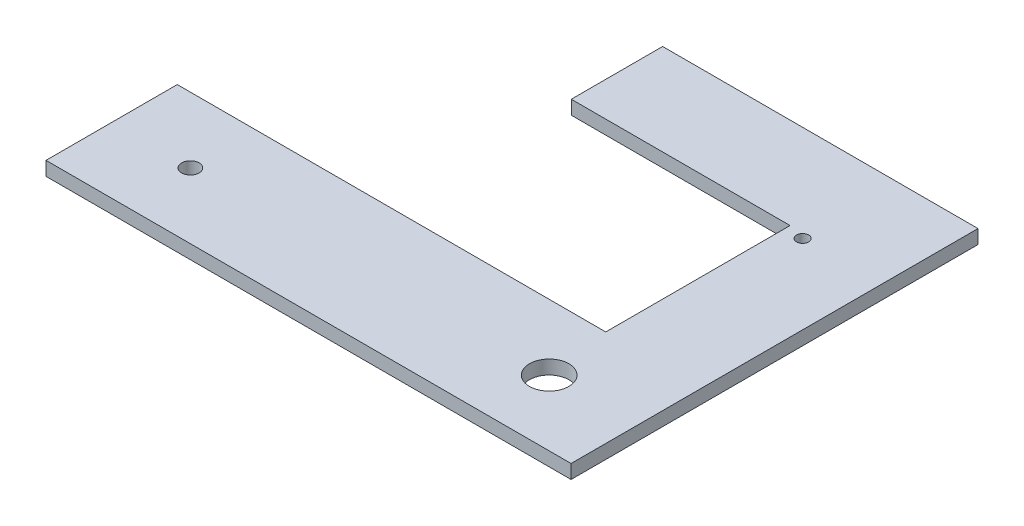
ISO-10303-21;
HEADER;
FILE_DESCRIPTION(('STEP AP214'),'2;1');
FILE_NAME('part.step','',(''),(''),'','','');
FILE_SCHEMA(('AUTOMOTIVE_DESIGN { 1 0 10303 214 1 1 1 1 }'));
ENDSEC;
DATA;
#1=APPLICATION_CONTEXT('core data for automotive mechanical design processes');
#2=APPLICATION_PROTOCOL_DEFINITION('international standard','automotive_design',2000,#1);
#3=PRODUCT_CONTEXT('',#1,'mechanical');
#4=PRODUCT('Part','Part','',(#3));
#5=PRODUCT_RELATED_PRODUCT_CATEGORY('part','',(#4));
#6=PRODUCT_DEFINITION_FORMATION('','',#4);
#7=PRODUCT_DEFINITION_CONTEXT('part definition',#1,'design');
#8=PRODUCT_DEFINITION('design','',#6,#7);
#9=PRODUCT_DEFINITION_SHAPE('','',#8);
#10=(LENGTH_UNIT() NAMED_UNIT(*) SI_UNIT(.MILLI.,.METRE.));
#11=(NAMED_UNIT(*) PLANE_ANGLE_UNIT() SI_UNIT($,.RADIAN.));
#12=(NAMED_UNIT(*) SI_UNIT($,.STERADIAN.) SOLID_ANGLE_UNIT());
#13=UNCERTAINTY_MEASURE_WITH_UNIT(LENGTH_MEASURE(1.E-05),#10,'distance_accuracy_value','');
#14=(GEOMETRIC_REPRESENTATION_CONTEXT(3) GLOBAL_UNCERTAINTY_ASSIGNED_CONTEXT((#13)) GLOBAL_UNIT_ASSIGNED_CONTEXT((#10,
#11,#12)) REPRESENTATION_CONTEXT('',''));
#15=CARTESIAN_POINT('',(0.,0.,0.));
#16=DIRECTION('',(0.,0.,1.));
#17=DIRECTION('',(1.,0.,0.));
#18=AXIS2_PLACEMENT_3D('',#15,#16,#17);
#19=CARTESIAN_POINT('',(97.9273861174557,0.,-93.));
#20=DIRECTION('',(1.,0.,0.));
#21=DIRECTION('',(0.,0.,-1.));
#22=AXIS2_PLACEMENT_3D('',#19,#20,#21);
#23=PLANE('',#22);
#24=DIRECTION('',(0.,1.,0.));
#25=VECTOR('',#24,1.);
#26=CARTESIAN_POINT('',(97.9273861174557,0.,-72.1241918278395));
#27=LINE('',#26,#25);
#28=CARTESIAN_POINT('',(97.9273861174557,0.,-72.1241918278395));
#29=VERTEX_POINT('',#28);
#30=CARTESIAN_POINT('',(97.9273861174557,3.175,-72.1241918278395));
#31=VERTEX_POINT('',#30);
#32=EDGE_CURVE('E138',#29,#31,#27,.T.);
#33=ORIENTED_EDGE('',*,*,#32,.F.);
#34=DIRECTION('',(0.,0.,1.));
#35=VECTOR('',#34,1.);
#36=CARTESIAN_POINT('',(97.9273861174557,0.,-93.));
#37=LINE('',#36,#35);
#38=CARTESIAN_POINT('',(97.9273861174557,0.,-30.));
#39=VERTEX_POINT('',#38);
#40=EDGE_CURVE('E58',#29,#39,#37,.T.);
#41=ORIENTED_EDGE('',*,*,#40,.T.);
#42=DIRECTION('',(0.,1.,0.));
#43=VECTOR('',#42,1.);
#44=CARTESIAN_POINT('',(97.9273861174557,0.,-30.));
#45=LINE('',#44,#43);
#46=CARTESIAN_POINT('',(97.9273861174557,3.175,-30.));
#47=VERTEX_POINT('',#46);
#48=EDGE_CURVE('E156',#39,#47,#45,.T.);
#49=ORIENTED_EDGE('',*,*,#48,.T.);
#50=DIRECTION('',(0.,0.,1.));
#51=VECTOR('',#50,1.);
#52=CARTESIAN_POINT('',(97.9273861174557,3.175,-93.));
#53=LINE('',#52,#51);
#54=EDGE_CURVE('E167',#31,#47,#53,.T.);
#55=ORIENTED_EDGE('',*,*,#54,.F.);
#56=EDGE_LOOP('',(#33,#41,#49,#55));
#57=FACE_BOUND('',#56,.T.);
#58=ADVANCED_FACE('F41',(#57),#23,.F.);
#59=CARTESIAN_POINT('',(0.,3.175,-30.));
#60=DIRECTION('',(0.,0.,1.));
#61=DIRECTION('',(1.,0.,0.));
#62=AXIS2_PLACEMENT_3D('',#59,#60,#61);
#63=PLANE('',#62);
#64=ORIENTED_EDGE('',*,*,#48,.F.);
#65=DIRECTION('',(-1.,0.,0.));
#66=VECTOR('',#65,1.);
#67=CARTESIAN_POINT('',(0.,0.,-30.));
#68=LINE('',#67,#66);
#69=CARTESIAN_POINT('',(0.,0.,-30.));
#70=VERTEX_POINT('',#69);
#71=EDGE_CURVE('E84',#39,#70,#68,.T.);
#72=ORIENTED_EDGE('',*,*,#71,.T.);
#73=DIRECTION('',(0.,-1.,0.));
#74=VECTOR('',#73,1.);
#75=CARTESIAN_POINT('',(0.,3.175,-30.));
#76=LINE('',#75,#74);
#77=CARTESIAN_POINT('',(0.,3.175,-30.));
#78=VERTEX_POINT('',#77);
#79=EDGE_CURVE('E197',#78,#70,#76,.T.);
#80=ORIENTED_EDGE('',*,*,#79,.F.);
#81=DIRECTION('',(-1.,0.,0.));
#82=VECTOR('',#81,1.);
#83=CARTESIAN_POINT('',(0.,3.175,-30.));
#84=LINE('',#83,#82);
#85=EDGE_CURVE('E67',#47,#78,#84,.T.);
#86=ORIENTED_EDGE('',*,*,#85,.F.);
#87=EDGE_LOOP('',(#64,#72,#80,#86));
#88=FACE_BOUND('',#87,.T.);
#89=ADVANCED_FACE('F246',(#88),#63,.F.);
#90=CARTESIAN_POINT('',(0.,3.175,0.));
#91=DIRECTION('',(1.,0.,0.));
#92=DIRECTION('',(0.,0.,-1.));
#93=AXIS2_PLACEMENT_3D('',#90,#91,#92);
#94=PLANE('',#93);
#95=DIRECTION('',(0.,0.,1.));
#96=VECTOR('',#95,1.);
#97=CARTESIAN_POINT('',(0.,0.,0.));
#98=LINE('',#97,#96);
#99=CARTESIAN_POINT('',(0.,0.,0.));
#100=VERTEX_POINT('',#99);
#101=EDGE_CURVE('E175',#70,#100,#98,.T.);
#102=ORIENTED_EDGE('',*,*,#101,.T.);
#103=DIRECTION('',(0.,-1.,0.));
#104=VECTOR('',#103,1.);
#105=CARTESIAN_POINT('',(0.,3.175,0.));
#106=LINE('',#105,#104);
#107=CARTESIAN_POINT('',(0.,3.175,0.));
#108=VERTEX_POINT('',#107);
#109=EDGE_CURVE('E11',#108,#100,#106,.T.);
#110=ORIENTED_EDGE('',*,*,#109,.F.);
#111=DIRECTION('',(0.,0.,1.));
#112=VECTOR('',#111,1.);
#113=CARTESIAN_POINT('',(0.,3.175,0.));
#114=LINE('',#113,#112);
#115=EDGE_CURVE('E187',#78,#108,#114,.T.);
#116=ORIENTED_EDGE('',*,*,#115,.F.);
#117=ORIENTED_EDGE('',*,*,#79,.T.);
#118=EDGE_LOOP('',(#102,#110,#116,#117));
#119=FACE_BOUND('',#118,.T.);
#120=ADVANCED_FACE('F43',(#119),#94,.F.);
#121=CARTESIAN_POINT('',(0.,3.175,0.));
#122=DIRECTION('',(0.,0.,-1.));
#123=DIRECTION('',(-1.,0.,0.));
#124=AXIS2_PLACEMENT_3D('',#121,#122,#123);
#125=PLANE('',#124);
#126=DIRECTION('',(1.,0.,0.));
#127=VECTOR('',#126,1.);
#128=CARTESIAN_POINT('',(0.,0.,0.));
#129=LINE('',#128,#127);
#130=CARTESIAN_POINT('',(120.,0.,0.));
#131=VERTEX_POINT('',#130);
#132=EDGE_CURVE('E201',#100,#131,#129,.T.);
#133=ORIENTED_EDGE('',*,*,#132,.T.);
#134=DIRECTION('',(0.,-1.,0.));
#135=VECTOR('',#134,1.);
#136=CARTESIAN_POINT('',(120.,3.175,0.));
#137=LINE('',#136,#135);
#138=CARTESIAN_POINT('',(120.,3.175,0.));
#139=VERTEX_POINT('',#138);
#140=EDGE_CURVE('E51',#139,#131,#137,.T.);
#141=ORIENTED_EDGE('',*,*,#140,.F.);
#142=DIRECTION('',(1.,0.,0.));
#143=VECTOR('',#142,1.);
#144=CARTESIAN_POINT('',(0.,3.175,0.));
#145=LINE('',#144,#143);
#146=EDGE_CURVE('E89',#108,#139,#145,.T.);
#147=ORIENTED_EDGE('',*,*,#146,.F.);
#148=ORIENTED_EDGE('',*,*,#109,.T.);
#149=EDGE_LOOP('',(#133,#141,#147,#148));
#150=FACE_BOUND('',#149,.T.);
#151=ADVANCED_FACE('F263',(#150),#125,.F.);
#152=CARTESIAN_POINT('',(120.,3.175,0.));
#153=DIRECTION('',(-1.,0.,0.));
#154=DIRECTION('',(0.,0.,1.));
#155=AXIS2_PLACEMENT_3D('',#152,#153,#154);
#156=PLANE('',#155);
#157=DIRECTION('',(0.,0.,-1.));
#158=VECTOR('',#157,1.);
#159=CARTESIAN_POINT('',(120.,0.,0.));
#160=LINE('',#159,#158);
#161=CARTESIAN_POINT('',(120.,0.,-93.));
#162=VERTEX_POINT('',#161);
#163=EDGE_CURVE('E204',#131,#162,#160,.T.);
#164=ORIENTED_EDGE('',*,*,#163,.T.);
#165=DIRECTION('',(0.,-1.,0.));
#166=VECTOR('',#165,1.);
#167=CARTESIAN_POINT('',(120.,0.,-93.));
#168=LINE('',#167,#166);
#169=CARTESIAN_POINT('',(120.,3.175,-93.));
#170=VERTEX_POINT('',#169);
#171=EDGE_CURVE('E155',#170,#162,#168,.T.);
#172=ORIENTED_EDGE('',*,*,#171,.F.);
#173=DIRECTION('',(0.,0.,-1.));
#174=VECTOR('',#173,1.);
#175=CARTESIAN_POINT('',(120.,3.175,0.));
#176=LINE('',#175,#174);
#177=EDGE_CURVE('E192',#139,#170,#176,.T.);
#178=ORIENTED_EDGE('',*,*,#177,.F.);
#179=ORIENTED_EDGE('',*,*,#140,.T.);
#180=EDGE_LOOP('',(#164,#172,#178,#179));
#181=FACE_BOUND('',#180,.T.);
#182=ADVANCED_FACE('F216',(#181),#156,.F.);
#183=CARTESIAN_POINT('',(0.,3.175,0.));
#184=DIRECTION('',(0.,-1.,0.));
#185=DIRECTION('',(0.,0.,-1.));
#186=AXIS2_PLACEMENT_3D('',#183,#184,#185);
#187=PLANE('',#186);
#188=CARTESIAN_POINT('',(101.927386117456,3.175,-71.));
#189=DIRECTION('',(0.,1.,0.));
#190=DIRECTION('',(0.,0.,1.));
#191=AXIS2_PLACEMENT_3D('',#188,#189,#190);
#192=CIRCLE('',#191,1.38181741069588);
#193=CARTESIAN_POINT('',(101.927386117456,3.175,-69.6181825893041));
#194=VERTEX_POINT('',#193);
#195=EDGE_CURVE('E143',#194,#194,#192,.T.);
#196=ORIENTED_EDGE('',*,*,#195,.F.);
#197=EDGE_LOOP('',(#196));
#198=FACE_BOUND('',#197,.T.);
#199=CARTESIAN_POINT('',(18.,3.175,-15.));
#200=DIRECTION('',(0.,1.,0.));
#201=DIRECTION('',(0.,0.,1.));
#202=AXIS2_PLACEMENT_3D('',#199,#200,#201);
#203=CIRCLE('',#202,2.);
#204=CARTESIAN_POINT('',(18.,3.175,-13.));
#205=VERTEX_POINT('',#204);
#206=EDGE_CURVE('E176',#205,#205,#203,.T.);
#207=ORIENTED_EDGE('',*,*,#206,.F.);
#208=EDGE_LOOP('',(#207));
#209=FACE_BOUND('',#208,.T.);
#210=CARTESIAN_POINT('',(100.,3.175,-15.));
#211=DIRECTION('',(0.,1.,0.));
#212=DIRECTION('',(0.,0.,1.));
#213=AXIS2_PLACEMENT_3D('',#210,#211,#212);
#214=CIRCLE('',#213,4.5);
#215=CARTESIAN_POINT('',(100.,3.175,-10.5));
#216=VERTEX_POINT('',#215);
#217=EDGE_CURVE('E170',#216,#216,#214,.T.);
#218=ORIENTED_EDGE('',*,*,#217,.F.);
#219=EDGE_LOOP('',(#218));
#220=FACE_BOUND('',#219,.T.);
#221=ORIENTED_EDGE('',*,*,#115,.T.);
#222=ORIENTED_EDGE('',*,*,#146,.T.);
#223=ORIENTED_EDGE('',*,*,#177,.T.);
#224=DIRECTION('',(1.,0.,0.));
#225=VECTOR('',#224,1.);
#226=CARTESIAN_POINT('',(97.9273861174557,3.175,-93.));
#227=LINE('',#226,#225);
#228=CARTESIAN_POINT('',(47.9273861174557,3.175,-93.));
#229=VERTEX_POINT('',#228);
#230=EDGE_CURVE('E123',#229,#170,#227,.T.);
#231=ORIENTED_EDGE('',*,*,#230,.F.);
#232=DIRECTION('',(0.,0.,-1.));
#233=VECTOR('',#232,1.);
#234=CARTESIAN_POINT('',(47.9273861174557,3.175,-72.1241918278395));
#235=LINE('',#234,#233);
#236=CARTESIAN_POINT('',(47.9273861174557,3.175,-72.1241918278395));
#237=VERTEX_POINT('',#236);
#238=EDGE_CURVE('E116',#237,#229,#235,.T.);
#239=ORIENTED_EDGE('',*,*,#238,.F.);
#240=DIRECTION('',(1.,0.,0.));
#241=VECTOR('',#240,1.);
#242=CARTESIAN_POINT('',(47.9273861174557,3.175,-72.1241918278395));
#243=LINE('',#242,#241);
#244=EDGE_CURVE('E120',#237,#31,#243,.T.);
#245=ORIENTED_EDGE('',*,*,#244,.T.);
#246=ORIENTED_EDGE('',*,*,#54,.T.);
#247=ORIENTED_EDGE('',*,*,#85,.T.);
#248=EDGE_LOOP('',(#221,#222,#223,#231,#239,#245,#246,#247));
#249=FACE_BOUND('',#248,.T.);
#250=ADVANCED_FACE('F118',(#198,#209,#220,#249),#187,.F.);
#251=CARTESIAN_POINT('',(0.,0.,0.));
#252=DIRECTION('',(0.,-1.,0.));
#253=DIRECTION('',(0.,0.,-1.));
#254=AXIS2_PLACEMENT_3D('',#251,#252,#253);
#255=PLANE('',#254);
#256=CARTESIAN_POINT('',(101.927386117456,0.,-71.));
#257=DIRECTION('',(0.,-1.,0.));
#258=DIRECTION('',(0.,0.,-1.));
#259=AXIS2_PLACEMENT_3D('',#256,#257,#258);
#260=CIRCLE('',#259,1.38181741069588);
#261=CARTESIAN_POINT('',(101.927386117456,0.,-72.3818174106959));
#262=VERTEX_POINT('',#261);
#263=EDGE_CURVE('E45',#262,#262,#260,.T.);
#264=ORIENTED_EDGE('',*,*,#263,.F.);
#265=EDGE_LOOP('',(#264));
#266=FACE_BOUND('',#265,.T.);
#267=CARTESIAN_POINT('',(18.,0.,-15.));
#268=DIRECTION('',(0.,1.,0.));
#269=DIRECTION('',(0.,0.,1.));
#270=AXIS2_PLACEMENT_3D('',#267,#268,#269);
#271=CIRCLE('',#270,2.);
#272=CARTESIAN_POINT('',(18.,0.,-13.));
#273=VERTEX_POINT('',#272);
#274=EDGE_CURVE('E171',#273,#273,#271,.T.);
#275=ORIENTED_EDGE('',*,*,#274,.T.);
#276=EDGE_LOOP('',(#275));
#277=FACE_BOUND('',#276,.T.);
#278=CARTESIAN_POINT('',(100.,0.,-15.));
#279=DIRECTION('',(0.,1.,0.));
#280=DIRECTION('',(0.,0.,1.));
#281=AXIS2_PLACEMENT_3D('',#278,#279,#280);
#282=CIRCLE('',#281,4.5);
#283=CARTESIAN_POINT('',(100.,0.,-10.5));
#284=VERTEX_POINT('',#283);
#285=EDGE_CURVE('E180',#284,#284,#282,.T.);
#286=ORIENTED_EDGE('',*,*,#285,.T.);
#287=EDGE_LOOP('',(#286));
#288=FACE_BOUND('',#287,.T.);
#289=ORIENTED_EDGE('',*,*,#101,.F.);
#290=ORIENTED_EDGE('',*,*,#71,.F.);
#291=ORIENTED_EDGE('',*,*,#40,.F.);
#292=DIRECTION('',(1.,0.,0.));
#293=VECTOR('',#292,1.);
#294=CARTESIAN_POINT('',(47.9273861174557,0.,-72.1241918278395));
#295=LINE('',#294,#293);
#296=CARTESIAN_POINT('',(47.9273861174557,0.,-72.1241918278395));
#297=VERTEX_POINT('',#296);
#298=EDGE_CURVE('E144',#297,#29,#295,.T.);
#299=ORIENTED_EDGE('',*,*,#298,.F.);
#300=DIRECTION('',(0.,0.,1.));
#301=VECTOR('',#300,1.);
#302=CARTESIAN_POINT('',(47.9273861174557,0.,-72.1241918278395));
#303=LINE('',#302,#301);
#304=CARTESIAN_POINT('',(47.9273861174557,0.,-93.));
#305=VERTEX_POINT('',#304);
#306=EDGE_CURVE('E134',#305,#297,#303,.T.);
#307=ORIENTED_EDGE('',*,*,#306,.F.);
#308=DIRECTION('',(-1.,0.,0.));
#309=VECTOR('',#308,1.);
#310=CARTESIAN_POINT('',(97.9273861174557,0.,-93.));
#311=LINE('',#310,#309);
#312=EDGE_CURVE('E160',#162,#305,#311,.T.);
#313=ORIENTED_EDGE('',*,*,#312,.F.);
#314=ORIENTED_EDGE('',*,*,#163,.F.);
#315=ORIENTED_EDGE('',*,*,#132,.F.);
#316=EDGE_LOOP('',(#289,#290,#291,#299,#307,#313,#314,#315));
#317=FACE_BOUND('',#316,.T.);
#318=ADVANCED_FACE('F221',(#266,#277,#288,#317),#255,.T.);
#319=CARTESIAN_POINT('',(100.,0.,-15.));
#320=DIRECTION('',(0.,1.,0.));
#321=DIRECTION('',(0.,0.,1.));
#322=AXIS2_PLACEMENT_3D('',#319,#320,#321);
#323=CYLINDRICAL_SURFACE('',#322,4.5);
#324=ORIENTED_EDGE('',*,*,#285,.F.);
#325=EDGE_LOOP('',(#324));
#326=FACE_BOUND('',#325,.T.);
#327=ORIENTED_EDGE('',*,*,#217,.T.);
#328=EDGE_LOOP('',(#327));
#329=FACE_BOUND('',#328,.T.);
#330=ADVANCED_FACE('F241',(#326,#329),#323,.F.);
#331=CARTESIAN_POINT('',(18.,0.,-15.));
#332=DIRECTION('',(0.,1.,0.));
#333=DIRECTION('',(0.,0.,1.));
#334=AXIS2_PLACEMENT_3D('',#331,#332,#333);
#335=CYLINDRICAL_SURFACE('',#334,2.);
#336=ORIENTED_EDGE('',*,*,#274,.F.);
#337=EDGE_LOOP('',(#336));
#338=FACE_BOUND('',#337,.T.);
#339=ORIENTED_EDGE('',*,*,#206,.T.);
#340=EDGE_LOOP('',(#339));
#341=FACE_BOUND('',#340,.T.);
#342=ADVANCED_FACE('F231',(#338,#341),#335,.F.);
#343=CARTESIAN_POINT('',(0.,0.,-93.));
#344=DIRECTION('',(0.,0.,-1.));
#345=DIRECTION('',(-1.,0.,0.));
#346=AXIS2_PLACEMENT_3D('',#343,#344,#345);
#347=PLANE('',#346);
#348=ORIENTED_EDGE('',*,*,#312,.T.);
#349=DIRECTION('',(0.,-1.,0.));
#350=VECTOR('',#349,1.);
#351=CARTESIAN_POINT('',(47.9273861174557,0.,-93.));
#352=LINE('',#351,#350);
#353=EDGE_CURVE('E128',#229,#305,#352,.T.);
#354=ORIENTED_EDGE('',*,*,#353,.F.);
#355=ORIENTED_EDGE('',*,*,#230,.T.);
#356=ORIENTED_EDGE('',*,*,#171,.T.);
#357=EDGE_LOOP('',(#348,#354,#355,#356));
#358=FACE_BOUND('',#357,.T.);
#359=ADVANCED_FACE('F223',(#358),#347,.T.);
#360=CARTESIAN_POINT('',(101.927386117456,-6.825,-71.));
#361=DIRECTION('',(0.,1.,0.));
#362=DIRECTION('',(0.,0.,1.));
#363=AXIS2_PLACEMENT_3D('',#360,#361,#362);
#364=CYLINDRICAL_SURFACE('',#363,1.38181741069588);
#365=ORIENTED_EDGE('',*,*,#263,.T.);
#366=EDGE_LOOP('',(#365));
#367=FACE_BOUND('',#366,.T.);
#368=ORIENTED_EDGE('',*,*,#195,.T.);
#369=EDGE_LOOP('',(#368));
#370=FACE_BOUND('',#369,.T.);
#371=ADVANCED_FACE('F230',(#367,#370),#364,.F.);
#372=CARTESIAN_POINT('',(47.9273861174557,0.,-72.1241918278395));
#373=DIRECTION('',(0.,0.,-1.));
#374=DIRECTION('',(-1.,0.,0.));
#375=AXIS2_PLACEMENT_3D('',#372,#373,#374);
#376=PLANE('',#375);
#377=ORIENTED_EDGE('',*,*,#32,.T.);
#378=ORIENTED_EDGE('',*,*,#244,.F.);
#379=DIRECTION('',(0.,1.,0.));
#380=VECTOR('',#379,1.);
#381=CARTESIAN_POINT('',(47.9273861174557,0.,-72.1241918278395));
#382=LINE('',#381,#380);
#383=EDGE_CURVE('E129',#297,#237,#382,.T.);
#384=ORIENTED_EDGE('',*,*,#383,.F.);
#385=ORIENTED_EDGE('',*,*,#298,.T.);
#386=EDGE_LOOP('',(#377,#378,#384,#385));
#387=FACE_BOUND('',#386,.T.);
#388=ADVANCED_FACE('F140',(#387),#376,.F.);
#389=CARTESIAN_POINT('',(47.9273861174557,0.,0.));
#390=DIRECTION('',(-1.,0.,0.));
#391=DIRECTION('',(0.,0.,1.));
#392=AXIS2_PLACEMENT_3D('',#389,#390,#391);
#393=PLANE('',#392);
#394=ORIENTED_EDGE('',*,*,#383,.T.);
#395=ORIENTED_EDGE('',*,*,#238,.T.);
#396=ORIENTED_EDGE('',*,*,#353,.T.);
#397=ORIENTED_EDGE('',*,*,#306,.T.);
#398=EDGE_LOOP('',(#394,#395,#396,#397));
#399=FACE_BOUND('',#398,.T.);
#400=ADVANCED_FACE('F132',(#399),#393,.T.);
#401=CLOSED_SHELL('',(#58,#89,#120,#151,#182,#250,#318,#330,#342,#359,#371,#388,#400));
#402=MANIFOLD_SOLID_BREP('B2',#401);
#403=ADVANCED_BREP_SHAPE_REPRESENTATION('',(#18,#402),#14);
#404=SHAPE_DEFINITION_REPRESENTATION(#9,#403);
ENDSEC;
END-ISO-10303-21;
